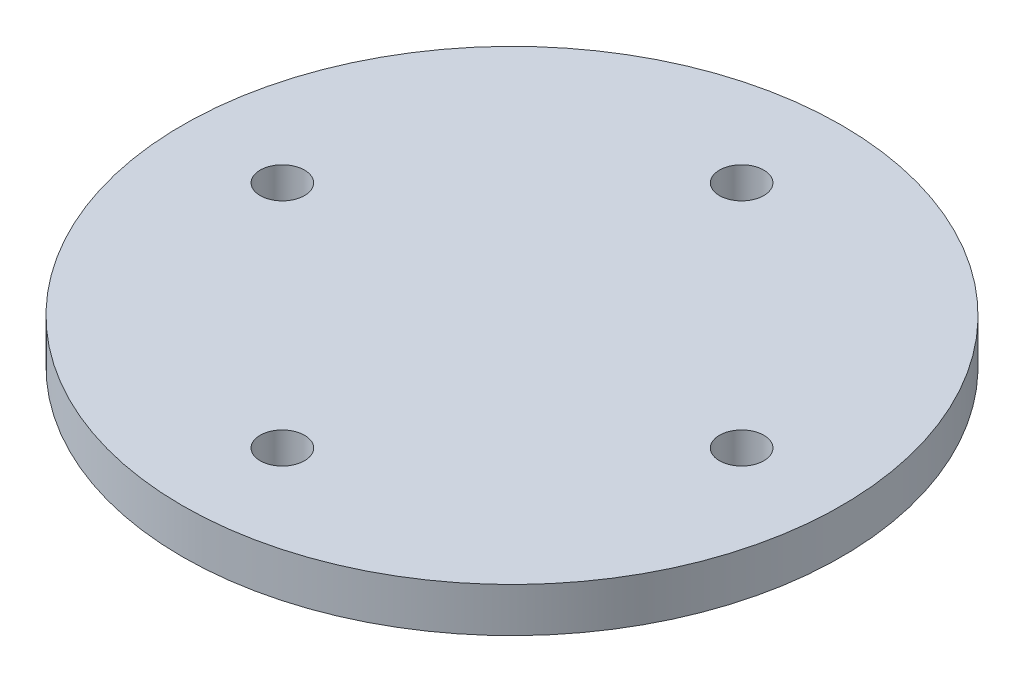
ISO-10303-21;
HEADER;
FILE_DESCRIPTION(('STEP AP214'),'2;1');
FILE_NAME('part.step','',(''),(''),'','','');
FILE_SCHEMA(('AUTOMOTIVE_DESIGN { 1 0 10303 214 1 1 1 1 }'));
ENDSEC;
DATA;
#1=APPLICATION_CONTEXT('core data for automotive mechanical design processes');
#2=APPLICATION_PROTOCOL_DEFINITION('international standard','automotive_design',2000,#1);
#3=PRODUCT_CONTEXT('',#1,'mechanical');
#4=PRODUCT('Part','Part','',(#3));
#5=PRODUCT_RELATED_PRODUCT_CATEGORY('part','',(#4));
#6=PRODUCT_DEFINITION_FORMATION('','',#4);
#7=PRODUCT_DEFINITION_CONTEXT('part definition',#1,'design');
#8=PRODUCT_DEFINITION('design','',#6,#7);
#9=PRODUCT_DEFINITION_SHAPE('','',#8);
#10=(LENGTH_UNIT() NAMED_UNIT(*) SI_UNIT(.MILLI.,.METRE.));
#11=(NAMED_UNIT(*) PLANE_ANGLE_UNIT() SI_UNIT($,.RADIAN.));
#12=(NAMED_UNIT(*) SI_UNIT($,.STERADIAN.) SOLID_ANGLE_UNIT());
#13=UNCERTAINTY_MEASURE_WITH_UNIT(LENGTH_MEASURE(1.E-05),#10,'distance_accuracy_value','');
#14=(GEOMETRIC_REPRESENTATION_CONTEXT(3) GLOBAL_UNCERTAINTY_ASSIGNED_CONTEXT((#13)) GLOBAL_UNIT_ASSIGNED_CONTEXT((#10,
#11,#12)) REPRESENTATION_CONTEXT('',''));
#15=CARTESIAN_POINT('',(0.,0.,0.));
#16=DIRECTION('',(0.,0.,1.));
#17=DIRECTION('',(1.,0.,0.));
#18=AXIS2_PLACEMENT_3D('',#15,#16,#17);
#19=CARTESIAN_POINT('',(0.,2.,0.));
#20=DIRECTION('',(0.,-1.,0.));
#21=DIRECTION('',(0.,0.,-1.));
#22=AXIS2_PLACEMENT_3D('',#19,#20,#21);
#23=CYLINDRICAL_SURFACE('',#22,14.875);
#24=CARTESIAN_POINT('',(0.,2.,0.));
#25=DIRECTION('',(0.,1.,0.));
#26=DIRECTION('',(0.,0.,1.));
#27=AXIS2_PLACEMENT_3D('',#24,#25,#26);
#28=CIRCLE('',#27,14.875);
#29=CARTESIAN_POINT('',(0.,2.,14.875));
#30=VERTEX_POINT('',#29);
#31=EDGE_CURVE('E85',#30,#30,#28,.T.);
#32=ORIENTED_EDGE('',*,*,#31,.F.);
#33=EDGE_LOOP('',(#32));
#34=FACE_BOUND('',#33,.T.);
#35=CARTESIAN_POINT('',(0.,0.,0.));
#36=DIRECTION('',(0.,1.,0.));
#37=DIRECTION('',(0.,0.,1.));
#38=AXIS2_PLACEMENT_3D('',#35,#36,#37);
#39=CIRCLE('',#38,14.875);
#40=CARTESIAN_POINT('',(0.,0.,14.875));
#41=VERTEX_POINT('',#40);
#42=EDGE_CURVE('E86',#41,#41,#39,.T.);
#43=ORIENTED_EDGE('',*,*,#42,.T.);
#44=EDGE_LOOP('',(#43));
#45=FACE_BOUND('',#44,.T.);
#46=ADVANCED_FACE('F44',(#34,#45),#23,.T.);
#47=CARTESIAN_POINT('',(0.,2.,0.));
#48=DIRECTION('',(0.,1.,0.));
#49=DIRECTION('',(0.,0.,1.));
#50=AXIS2_PLACEMENT_3D('',#47,#48,#49);
#51=PLANE('',#50);
#52=CARTESIAN_POINT('',(0.,2.,-10.365));
#53=DIRECTION('',(0.,1.,0.));
#54=DIRECTION('',(0.,0.,1.));
#55=AXIS2_PLACEMENT_3D('',#52,#53,#54);
#56=CIRCLE('',#55,0.999999999999995);
#57=CARTESIAN_POINT('',(0.,2.,-9.36500000000001));
#58=VERTEX_POINT('',#57);
#59=EDGE_CURVE('E105',#58,#58,#56,.T.);
#60=ORIENTED_EDGE('',*,*,#59,.F.);
#61=EDGE_LOOP('',(#60));
#62=FACE_BOUND('',#61,.T.);
#63=CARTESIAN_POINT('',(10.365,2.,0.));
#64=DIRECTION('',(0.,1.,0.));
#65=DIRECTION('',(0.,0.,1.));
#66=AXIS2_PLACEMENT_3D('',#63,#64,#65);
#67=CIRCLE('',#66,0.999999999999996);
#68=CARTESIAN_POINT('',(10.365,2.,1.00000000000003));
#69=VERTEX_POINT('',#68);
#70=EDGE_CURVE('E101',#69,#69,#67,.T.);
#71=ORIENTED_EDGE('',*,*,#70,.F.);
#72=EDGE_LOOP('',(#71));
#73=FACE_BOUND('',#72,.T.);
#74=CARTESIAN_POINT('',(0.,2.,10.365));
#75=DIRECTION('',(0.,1.,0.));
#76=DIRECTION('',(0.,0.,1.));
#77=AXIS2_PLACEMENT_3D('',#74,#75,#76);
#78=CIRCLE('',#77,0.999999999999995);
#79=CARTESIAN_POINT('',(0.,2.,11.365));
#80=VERTEX_POINT('',#79);
#81=EDGE_CURVE('E97',#80,#80,#78,.T.);
#82=ORIENTED_EDGE('',*,*,#81,.F.);
#83=EDGE_LOOP('',(#82));
#84=FACE_BOUND('',#83,.T.);
#85=CARTESIAN_POINT('',(-10.365,2.,-1.08567612231327E-13));
#86=DIRECTION('',(0.,1.,0.));
#87=DIRECTION('',(0.,0.,1.));
#88=AXIS2_PLACEMENT_3D('',#85,#86,#87);
#89=CIRCLE('',#88,0.999999999999994);
#90=CARTESIAN_POINT('',(-10.365,2.,0.999999999999885));
#91=VERTEX_POINT('',#90);
#92=EDGE_CURVE('E90',#91,#91,#89,.T.);
#93=ORIENTED_EDGE('',*,*,#92,.F.);
#94=EDGE_LOOP('',(#93));
#95=FACE_BOUND('',#94,.T.);
#96=ORIENTED_EDGE('',*,*,#31,.T.);
#97=EDGE_LOOP('',(#96));
#98=FACE_BOUND('',#97,.T.);
#99=ADVANCED_FACE('F112',(#62,#73,#84,#95,#98),#51,.T.);
#100=CARTESIAN_POINT('',(0.,0.,0.));
#101=DIRECTION('',(0.,1.,0.));
#102=DIRECTION('',(0.,0.,1.));
#103=AXIS2_PLACEMENT_3D('',#100,#101,#102);
#104=PLANE('',#103);
#105=CARTESIAN_POINT('',(10.365,0.,0.));
#106=DIRECTION('',(0.,1.,0.));
#107=DIRECTION('',(0.,0.,1.));
#108=AXIS2_PLACEMENT_3D('',#105,#106,#107);
#109=CIRCLE('',#108,1.49999999999999);
#110=CARTESIAN_POINT('',(10.365,0.,1.50000000000003));
#111=VERTEX_POINT('',#110);
#112=EDGE_CURVE('E69',#111,#111,#109,.T.);
#113=ORIENTED_EDGE('',*,*,#112,.T.);
#114=EDGE_LOOP('',(#113));
#115=FACE_BOUND('',#114,.T.);
#116=CARTESIAN_POINT('',(0.,0.,10.365));
#117=DIRECTION('',(0.,1.,0.));
#118=DIRECTION('',(0.,0.,1.));
#119=AXIS2_PLACEMENT_3D('',#116,#117,#118);
#120=CIRCLE('',#119,1.49999999999999);
#121=CARTESIAN_POINT('',(0.,0.,11.865));
#122=VERTEX_POINT('',#121);
#123=EDGE_CURVE('E73',#122,#122,#120,.T.);
#124=ORIENTED_EDGE('',*,*,#123,.T.);
#125=EDGE_LOOP('',(#124));
#126=FACE_BOUND('',#125,.T.);
#127=CARTESIAN_POINT('',(0.,0.,-10.365));
#128=DIRECTION('',(0.,1.,0.));
#129=DIRECTION('',(0.,0.,1.));
#130=AXIS2_PLACEMENT_3D('',#127,#128,#129);
#131=CIRCLE('',#130,1.49999999999999);
#132=CARTESIAN_POINT('',(0.,0.,-8.86500000000001));
#133=VERTEX_POINT('',#132);
#134=EDGE_CURVE('E77',#133,#133,#131,.T.);
#135=ORIENTED_EDGE('',*,*,#134,.T.);
#136=EDGE_LOOP('',(#135));
#137=FACE_BOUND('',#136,.T.);
#138=CARTESIAN_POINT('',(-10.365,0.,-1.08567612231327E-13));
#139=DIRECTION('',(0.,1.,0.));
#140=DIRECTION('',(0.,0.,1.));
#141=AXIS2_PLACEMENT_3D('',#138,#139,#140);
#142=CIRCLE('',#141,1.49999999999999);
#143=CARTESIAN_POINT('',(-10.365,0.,1.49999999999989));
#144=VERTEX_POINT('',#143);
#145=EDGE_CURVE('E81',#144,#144,#142,.T.);
#146=ORIENTED_EDGE('',*,*,#145,.T.);
#147=EDGE_LOOP('',(#146));
#148=FACE_BOUND('',#147,.T.);
#149=ORIENTED_EDGE('',*,*,#42,.F.);
#150=EDGE_LOOP('',(#149));
#151=FACE_BOUND('',#150,.T.);
#152=ADVANCED_FACE('F115',(#115,#126,#137,#148,#151),#104,.F.);
#153=CARTESIAN_POINT('',(-10.365,2.,-1.08567612231327E-13));
#154=DIRECTION('',(0.,1.,0.));
#155=DIRECTION('',(0.,0.,1.));
#156=AXIS2_PLACEMENT_3D('',#153,#154,#155);
#157=CYLINDRICAL_SURFACE('',#156,0.999999999999992);
#158=CARTESIAN_POINT('',(-10.365,0.500000000000002,-1.08567612231327E-13));
#159=DIRECTION('',(0.,1.,0.));
#160=DIRECTION('',(0.,0.,1.));
#161=AXIS2_PLACEMENT_3D('',#158,#159,#160);
#162=CIRCLE('',#161,0.999999999999992);
#163=CARTESIAN_POINT('',(-10.365,0.500000000000002,0.999999999999884));
#164=VERTEX_POINT('',#163);
#165=EDGE_CURVE('E10',#164,#164,#162,.F.);
#166=ORIENTED_EDGE('',*,*,#165,.T.);
#167=EDGE_LOOP('',(#166));
#168=FACE_BOUND('',#167,.T.);
#169=ORIENTED_EDGE('',*,*,#92,.T.);
#170=EDGE_LOOP('',(#169));
#171=FACE_BOUND('',#170,.T.);
#172=ADVANCED_FACE('F131',(#168,#171),#157,.F.);
#173=CARTESIAN_POINT('',(0.,2.,10.365));
#174=DIRECTION('',(0.,1.,0.));
#175=DIRECTION('',(0.,0.,1.));
#176=AXIS2_PLACEMENT_3D('',#173,#174,#175);
#177=CYLINDRICAL_SURFACE('',#176,0.999999999999992);
#178=CARTESIAN_POINT('',(0.,0.500000000000002,10.365));
#179=DIRECTION('',(0.,1.,0.));
#180=DIRECTION('',(0.,0.,1.));
#181=AXIS2_PLACEMENT_3D('',#178,#179,#180);
#182=CIRCLE('',#181,0.999999999999992);
#183=CARTESIAN_POINT('',(0.,0.500000000000002,11.365));
#184=VERTEX_POINT('',#183);
#185=EDGE_CURVE('E58',#184,#184,#182,.F.);
#186=ORIENTED_EDGE('',*,*,#185,.T.);
#187=EDGE_LOOP('',(#186));
#188=FACE_BOUND('',#187,.T.);
#189=ORIENTED_EDGE('',*,*,#81,.T.);
#190=EDGE_LOOP('',(#189));
#191=FACE_BOUND('',#190,.T.);
#192=ADVANCED_FACE('F137',(#188,#191),#177,.F.);
#193=CARTESIAN_POINT('',(10.365,2.,0.));
#194=DIRECTION('',(0.,1.,0.));
#195=DIRECTION('',(0.,0.,1.));
#196=AXIS2_PLACEMENT_3D('',#193,#194,#195);
#197=CYLINDRICAL_SURFACE('',#196,0.999999999999992);
#198=CARTESIAN_POINT('',(10.365,0.500000000000002,0.));
#199=DIRECTION('',(0.,1.,0.));
#200=DIRECTION('',(0.,0.,1.));
#201=AXIS2_PLACEMENT_3D('',#198,#199,#200);
#202=CIRCLE('',#201,0.999999999999992);
#203=CARTESIAN_POINT('',(10.365,0.500000000000002,1.00000000000003));
#204=VERTEX_POINT('',#203);
#205=EDGE_CURVE('E63',#204,#204,#202,.F.);
#206=ORIENTED_EDGE('',*,*,#205,.T.);
#207=EDGE_LOOP('',(#206));
#208=FACE_BOUND('',#207,.T.);
#209=ORIENTED_EDGE('',*,*,#70,.T.);
#210=EDGE_LOOP('',(#209));
#211=FACE_BOUND('',#210,.T.);
#212=ADVANCED_FACE('F198',(#208,#211),#197,.F.);
#213=CARTESIAN_POINT('',(0.,2.,-10.365));
#214=DIRECTION('',(0.,1.,0.));
#215=DIRECTION('',(0.,0.,1.));
#216=AXIS2_PLACEMENT_3D('',#213,#214,#215);
#217=CYLINDRICAL_SURFACE('',#216,0.999999999999992);
#218=CARTESIAN_POINT('',(0.,0.500000000000002,-10.365));
#219=DIRECTION('',(0.,1.,0.));
#220=DIRECTION('',(0.,0.,1.));
#221=AXIS2_PLACEMENT_3D('',#218,#219,#220);
#222=CIRCLE('',#221,0.999999999999992);
#223=CARTESIAN_POINT('',(0.,0.500000000000002,-9.36500000000001));
#224=VERTEX_POINT('',#223);
#225=EDGE_CURVE('E53',#224,#224,#222,.F.);
#226=ORIENTED_EDGE('',*,*,#225,.T.);
#227=EDGE_LOOP('',(#226));
#228=FACE_BOUND('',#227,.T.);
#229=ORIENTED_EDGE('',*,*,#59,.T.);
#230=EDGE_LOOP('',(#229));
#231=FACE_BOUND('',#230,.T.);
#232=ADVANCED_FACE('F110',(#228,#231),#217,.F.);
#233=CARTESIAN_POINT('',(10.365,0.,0.));
#234=DIRECTION('',(0.,-1.,0.));
#235=DIRECTION('',(0.,0.,-1.));
#236=AXIS2_PLACEMENT_3D('',#233,#234,#235);
#237=CONICAL_SURFACE('',#236,1.49999999999999,0.785398163397448);
#238=ORIENTED_EDGE('',*,*,#205,.F.);
#239=EDGE_LOOP('',(#238));
#240=FACE_BOUND('',#239,.T.);
#241=ORIENTED_EDGE('',*,*,#112,.F.);
#242=EDGE_LOOP('',(#241));
#243=FACE_BOUND('',#242,.T.);
#244=ADVANCED_FACE('F142',(#240,#243),#237,.F.);
#245=CARTESIAN_POINT('',(0.,0.,10.365));
#246=DIRECTION('',(0.,-1.,0.));
#247=DIRECTION('',(0.,0.,-1.));
#248=AXIS2_PLACEMENT_3D('',#245,#246,#247);
#249=CONICAL_SURFACE('',#248,1.49999999999999,0.785398163397448);
#250=ORIENTED_EDGE('',*,*,#185,.F.);
#251=EDGE_LOOP('',(#250));
#252=FACE_BOUND('',#251,.T.);
#253=ORIENTED_EDGE('',*,*,#123,.F.);
#254=EDGE_LOOP('',(#253));
#255=FACE_BOUND('',#254,.T.);
#256=ADVANCED_FACE('F148',(#252,#255),#249,.F.);
#257=CARTESIAN_POINT('',(0.,0.,-10.365));
#258=DIRECTION('',(0.,-1.,0.));
#259=DIRECTION('',(0.,0.,-1.));
#260=AXIS2_PLACEMENT_3D('',#257,#258,#259);
#261=CONICAL_SURFACE('',#260,1.49999999999999,0.785398163397448);
#262=ORIENTED_EDGE('',*,*,#225,.F.);
#263=EDGE_LOOP('',(#262));
#264=FACE_BOUND('',#263,.T.);
#265=ORIENTED_EDGE('',*,*,#134,.F.);
#266=EDGE_LOOP('',(#265));
#267=FACE_BOUND('',#266,.T.);
#268=ADVANCED_FACE('F154',(#264,#267),#261,.F.);
#269=CARTESIAN_POINT('',(-10.365,0.,-1.08567612231327E-13));
#270=DIRECTION('',(0.,-1.,0.));
#271=DIRECTION('',(0.,0.,-1.));
#272=AXIS2_PLACEMENT_3D('',#269,#270,#271);
#273=CONICAL_SURFACE('',#272,1.49999999999999,0.785398163397448);
#274=ORIENTED_EDGE('',*,*,#165,.F.);
#275=EDGE_LOOP('',(#274));
#276=FACE_BOUND('',#275,.T.);
#277=ORIENTED_EDGE('',*,*,#145,.F.);
#278=EDGE_LOOP('',(#277));
#279=FACE_BOUND('',#278,.T.);
#280=ADVANCED_FACE('F47',(#276,#279),#273,.F.);
#281=CLOSED_SHELL('',(#46,#99,#152,#172,#192,#212,#232,#244,#256,#268,#280));
#282=MANIFOLD_SOLID_BREP('B2',#281);
#283=ADVANCED_BREP_SHAPE_REPRESENTATION('',(#18,#282),#14);
#284=SHAPE_DEFINITION_REPRESENTATION(#9,#283);
ENDSEC;
END-ISO-10303-21;
